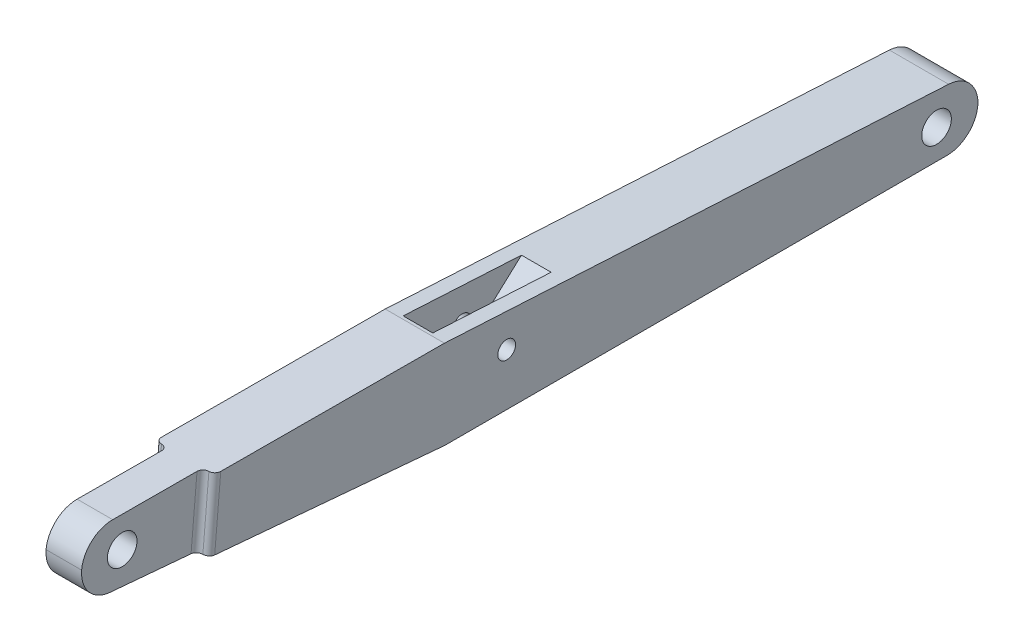
ISO-10303-21;
HEADER;
FILE_DESCRIPTION(('STEP AP214'),'2;1');
FILE_NAME('part.step','',(''),(''),'','','');
FILE_SCHEMA(('AUTOMOTIVE_DESIGN { 1 0 10303 214 1 1 1 1 }'));
ENDSEC;
DATA;
#1=APPLICATION_CONTEXT('core data for automotive mechanical design processes');
#2=APPLICATION_PROTOCOL_DEFINITION('international standard','automotive_design',2000,#1);
#3=PRODUCT_CONTEXT('',#1,'mechanical');
#4=PRODUCT('Part','Part','',(#3));
#5=PRODUCT_RELATED_PRODUCT_CATEGORY('part','',(#4));
#6=PRODUCT_DEFINITION_FORMATION('','',#4);
#7=PRODUCT_DEFINITION_CONTEXT('part definition',#1,'design');
#8=PRODUCT_DEFINITION('design','',#6,#7);
#9=PRODUCT_DEFINITION_SHAPE('','',#8);
#10=(LENGTH_UNIT() NAMED_UNIT(*) SI_UNIT(.MILLI.,.METRE.));
#11=(NAMED_UNIT(*) PLANE_ANGLE_UNIT() SI_UNIT($,.RADIAN.));
#12=(NAMED_UNIT(*) SI_UNIT($,.STERADIAN.) SOLID_ANGLE_UNIT());
#13=UNCERTAINTY_MEASURE_WITH_UNIT(LENGTH_MEASURE(1.E-05),#10,'distance_accuracy_value','');
#14=(GEOMETRIC_REPRESENTATION_CONTEXT(3) GLOBAL_UNCERTAINTY_ASSIGNED_CONTEXT((#13)) GLOBAL_UNIT_ASSIGNED_CONTEXT((#10,
#11,#12)) REPRESENTATION_CONTEXT('',''));
#15=CARTESIAN_POINT('',(0.,0.,0.));
#16=DIRECTION('',(0.,0.,1.));
#17=DIRECTION('',(1.,0.,0.));
#18=AXIS2_PLACEMENT_3D('',#15,#16,#17);
#19=CARTESIAN_POINT('',(-5.00000000000001,10.,-45.));
#20=DIRECTION('',(0.,0.998478855903235,-0.0551359620771031));
#21=DIRECTION('',(0.,0.0551359620771031,0.998478855903235));
#22=AXIS2_PLACEMENT_3D('',#19,#20,#21);
#23=PLANE('',#22);
#24=DIRECTION('',(0.,0.0551359620771031,0.998478855903235));
#25=VECTOR('',#24,1.);
#26=CARTESIAN_POINT('',(4.99999999999999,10.,-45.));
#27=LINE('',#26,#25);
#28=CARTESIAN_POINT('',(4.99999999999999,10.273920608472,-40.0394638009048));
#29=VERTEX_POINT('',#28);
#30=CARTESIAN_POINT('',(5.,14.9738745348943,45.0738532151212));
#31=VERTEX_POINT('',#30);
#32=EDGE_CURVE('E256',#29,#31,#27,.T.);
#33=ORIENTED_EDGE('',*,*,#32,.F.);
#34=DIRECTION('',(-1.,0.,0.));
#35=VECTOR('',#34,1.);
#36=CARTESIAN_POINT('',(-5.00000000000001,10.273920608472,-40.0394638009048));
#37=LINE('',#36,#35);
#38=CARTESIAN_POINT('',(-5.00000000000001,10.273920608472,-40.0394638009048));
#39=VERTEX_POINT('',#38);
#40=EDGE_CURVE('E314',#29,#39,#37,.T.);
#41=ORIENTED_EDGE('',*,*,#40,.T.);
#42=DIRECTION('',(0.,0.0551359620771031,0.998478855903235));
#43=VECTOR('',#42,1.);
#44=CARTESIAN_POINT('',(-5.00000000000001,10.,-45.));
#45=LINE('',#44,#43);
#46=CARTESIAN_POINT('',(-5.,14.9738745348943,45.0738532151212));
#47=VERTEX_POINT('',#46);
#48=EDGE_CURVE('E257',#39,#47,#45,.T.);
#49=ORIENTED_EDGE('',*,*,#48,.T.);
#50=DIRECTION('',(1.,0.,0.));
#51=VECTOR('',#50,1.);
#52=CARTESIAN_POINT('',(-5.,14.9738745348943,45.0738532151212));
#53=LINE('',#52,#51);
#54=EDGE_CURVE('E263',#47,#31,#53,.T.);
#55=ORIENTED_EDGE('',*,*,#54,.T.);
#56=EDGE_LOOP('',(#33,#41,#49,#55));
#57=FACE_BOUND('',#56,.T.);
#58=DIRECTION('',(1.,0.,0.));
#59=VECTOR('',#58,1.);
#60=CARTESIAN_POINT('',(-2.5,14.9442362529549,44.5371218926417));
#61=LINE('',#60,#59);
#62=CARTESIAN_POINT('',(-2.5,14.9442362529549,44.5371218926417));
#63=VERTEX_POINT('',#62);
#64=CARTESIAN_POINT('',(2.5,14.9442362529549,44.5371218926417));
#65=VERTEX_POINT('',#64);
#66=EDGE_CURVE('E236',#63,#65,#61,.T.);
#67=ORIENTED_EDGE('',*,*,#66,.F.);
#68=DIRECTION('',(0.,0.0551359620771032,0.998478855903235));
#69=VECTOR('',#68,1.);
#70=CARTESIAN_POINT('',(-2.5,12.4469444118825,-0.68731976747625));
#71=LINE('',#70,#69);
#72=CARTESIAN_POINT('',(-2.5,13.8412876164544,24.5633905709148));
#73=VERTEX_POINT('',#72);
#74=EDGE_CURVE('E212',#73,#63,#71,.T.);
#75=ORIENTED_EDGE('',*,*,#74,.F.);
#76=DIRECTION('',(1.,0.,0.));
#77=VECTOR('',#76,1.);
#78=CARTESIAN_POINT('',(-2.5,13.8412876164544,24.5633905709148));
#79=LINE('',#78,#77);
#80=CARTESIAN_POINT('',(2.5,13.8412876164544,24.5633905709148));
#81=VERTEX_POINT('',#80);
#82=EDGE_CURVE('E239',#73,#81,#79,.T.);
#83=ORIENTED_EDGE('',*,*,#82,.T.);
#84=DIRECTION('',(0.,0.0551359620771032,0.998478855903235));
#85=VECTOR('',#84,1.);
#86=CARTESIAN_POINT('',(2.5,12.4469444118825,-0.68731976747625));
#87=LINE('',#86,#85);
#88=EDGE_CURVE('E217',#81,#65,#87,.T.);
#89=ORIENTED_EDGE('',*,*,#88,.T.);
#90=EDGE_LOOP('',(#67,#75,#83,#89));
#91=FACE_BOUND('',#90,.T.);
#92=ADVANCED_FACE('F60',(#57,#91),#23,.T.);
#93=CARTESIAN_POINT('',(4.99999999999999,10.,-45.));
#94=DIRECTION('',(-1.,0.,0.));
#95=DIRECTION('',(0.,0.,1.));
#96=AXIS2_PLACEMENT_3D('',#93,#94,#95);
#97=PLANE('',#96);
#98=CARTESIAN_POINT('',(4.99999999999999,5.,-38.));
#99=DIRECTION('',(1.,0.,0.));
#100=DIRECTION('',(0.,0.,-1.));
#101=AXIS2_PLACEMENT_3D('',#98,#99,#100);
#102=CIRCLE('',#101,2.5);
#103=CARTESIAN_POINT('',(4.99999999999999,5.,-40.5));
#104=VERTEX_POINT('',#103);
#105=EDGE_CURVE('E341',#104,#104,#102,.T.);
#106=ORIENTED_EDGE('',*,*,#105,.F.);
#107=EDGE_LOOP('',(#106));
#108=FACE_BOUND('',#107,.T.);
#109=CARTESIAN_POINT('',(5.,8.7714878497158,34.5633905709148));
#110=DIRECTION('',(1.,0.,0.));
#111=DIRECTION('',(0.,0.,-1.));
#112=AXIS2_PLACEMENT_3D('',#109,#110,#111);
#113=CIRCLE('',#112,1.5);
#114=CARTESIAN_POINT('',(5.,8.7714878497158,33.0633905709148));
#115=VERTEX_POINT('',#114);
#116=EDGE_CURVE('E220',#115,#115,#113,.T.);
#117=ORIENTED_EDGE('',*,*,#116,.F.);
#118=EDGE_LOOP('',(#117));
#119=FACE_BOUND('',#118,.T.);
#120=DIRECTION('',(0.,-0.0036958916716528,-0.999993170169052));
#121=VECTOR('',#120,1.);
#122=CARTESIAN_POINT('',(5.00000000000001,15.1912915457768,103.900124458028));
#123=LINE('',#122,#121);
#124=CARTESIAN_POINT('',(5.00000000000001,15.1134060010895,82.8267219718306));
#125=VERTEX_POINT('',#124);
#126=EDGE_CURVE('E261',#125,#31,#123,.T.);
#127=ORIENTED_EDGE('',*,*,#126,.F.);
#128=DIRECTION('',(0.,0.996194698091746,-0.0871557427476552));
#129=VECTOR('',#128,1.);
#130=CARTESIAN_POINT('',(5.00000000000001,21.1372807272312,82.2997012227929));
#131=LINE('',#130,#129);
#132=CARTESIAN_POINT('',(5.,3.39907396715855,83.8515932255781));
#133=VERTEX_POINT('',#132);
#134=EDGE_CURVE('E84',#125,#133,#131,.F.);
#135=ORIENTED_EDGE('',*,*,#134,.T.);
#136=DIRECTION('',(0.,0.087155742747655,0.996194698091746));
#137=VECTOR('',#136,1.);
#138=CARTESIAN_POINT('',(5.,0.,45.));
#139=LINE('',#138,#137);
#140=CARTESIAN_POINT('',(5.,0.,45.));
#141=VERTEX_POINT('',#140);
#142=EDGE_CURVE('E271',#141,#133,#139,.T.);
#143=ORIENTED_EDGE('',*,*,#142,.F.);
#144=DIRECTION('',(0.,0.,-1.));
#145=VECTOR('',#144,1.);
#146=CARTESIAN_POINT('',(4.99999999999999,0.,-45.));
#147=LINE('',#146,#145);
#148=CARTESIAN_POINT('',(4.99999999999999,0.,-39.75));
#149=VERTEX_POINT('',#148);
#150=EDGE_CURVE('E273',#141,#149,#147,.T.);
#151=ORIENTED_EDGE('',*,*,#150,.T.);
#152=CARTESIAN_POINT('',(4.99999999999999,5.25,-39.75));
#153=DIRECTION('',(-1.,0.,0.));
#154=DIRECTION('',(0.,0.,1.));
#155=AXIS2_PLACEMENT_3D('',#152,#153,#154);
#156=CIRCLE('',#155,5.25);
#157=CARTESIAN_POINT('',(4.99999999999999,5.14095330748999,-44.9988673843842));
#158=VERTEX_POINT('',#157);
#159=EDGE_CURVE('E312',#149,#158,#156,.F.);
#160=ORIENTED_EDGE('',*,*,#159,.T.);
#161=CARTESIAN_POINT('',(4.99999999999999,5.03190661497999,-39.75));
#162=DIRECTION('',(-1.,0.,0.));
#163=DIRECTION('',(0.,0.,1.));
#164=AXIS2_PLACEMENT_3D('',#161,#162,#163);
#165=CIRCLE('',#164,5.25);
#166=EDGE_CURVE('E310',#158,#29,#165,.F.);
#167=ORIENTED_EDGE('',*,*,#166,.T.);
#168=ORIENTED_EDGE('',*,*,#32,.T.);
#169=EDGE_LOOP('',(#127,#135,#143,#151,#160,#167,#168));
#170=FACE_BOUND('',#169,.T.);
#171=ADVANCED_FACE('F359',(#108,#119,#170),#97,.F.);
#172=CARTESIAN_POINT('',(-5.00000000000001,10.,-45.));
#173=DIRECTION('',(1.,0.,0.));
#174=DIRECTION('',(0.,0.,-1.));
#175=AXIS2_PLACEMENT_3D('',#172,#173,#174);
#176=PLANE('',#175);
#177=CARTESIAN_POINT('',(-5.00000000000003,5.,-38.));
#178=DIRECTION('',(1.,0.,0.));
#179=DIRECTION('',(0.,0.,-1.));
#180=AXIS2_PLACEMENT_3D('',#177,#178,#179);
#181=CIRCLE('',#180,2.5);
#182=CARTESIAN_POINT('',(-5.00000000000003,5.,-40.5));
#183=VERTEX_POINT('',#182);
#184=EDGE_CURVE('E319',#183,#183,#181,.T.);
#185=ORIENTED_EDGE('',*,*,#184,.T.);
#186=EDGE_LOOP('',(#185));
#187=FACE_BOUND('',#186,.T.);
#188=CARTESIAN_POINT('',(-5.00000000000002,8.7714878497158,34.5633905709148));
#189=DIRECTION('',(1.,0.,0.));
#190=DIRECTION('',(0.,0.,-1.));
#191=AXIS2_PLACEMENT_3D('',#188,#189,#190);
#192=CIRCLE('',#191,1.5);
#193=CARTESIAN_POINT('',(-5.00000000000002,8.7714878497158,33.0633905709148));
#194=VERTEX_POINT('',#193);
#195=EDGE_CURVE('E229',#194,#194,#192,.T.);
#196=ORIENTED_EDGE('',*,*,#195,.T.);
#197=EDGE_LOOP('',(#196));
#198=FACE_BOUND('',#197,.T.);
#199=DIRECTION('',(0.,-0.087155742747655,-0.996194698091746));
#200=VECTOR('',#199,1.);
#201=CARTESIAN_POINT('',(-5.,0.,45.));
#202=LINE('',#201,#200);
#203=CARTESIAN_POINT('',(-5.,3.39907396715855,83.8515932255781));
#204=VERTEX_POINT('',#203);
#205=CARTESIAN_POINT('',(-5.,0.,45.));
#206=VERTEX_POINT('',#205);
#207=EDGE_CURVE('E269',#204,#206,#202,.T.);
#208=ORIENTED_EDGE('',*,*,#207,.F.);
#209=DIRECTION('',(0.,0.996194698091746,-0.0871557427476552));
#210=VECTOR('',#209,1.);
#211=CARTESIAN_POINT('',(-4.99999999999999,21.1372807272312,82.2997012227929));
#212=LINE('',#211,#210);
#213=CARTESIAN_POINT('',(-4.99999999999999,15.1134060010895,82.8267219718306));
#214=VERTEX_POINT('',#213);
#215=EDGE_CURVE('E322',#204,#214,#212,.T.);
#216=ORIENTED_EDGE('',*,*,#215,.T.);
#217=DIRECTION('',(0.,-0.0036958916716528,-0.999993170169052));
#218=VECTOR('',#217,1.);
#219=CARTESIAN_POINT('',(-4.99999999999999,15.1912915457768,103.900124458028));
#220=LINE('',#219,#218);
#221=EDGE_CURVE('E260',#214,#47,#220,.T.);
#222=ORIENTED_EDGE('',*,*,#221,.T.);
#223=ORIENTED_EDGE('',*,*,#48,.F.);
#224=CARTESIAN_POINT('',(-5.00000000000001,5.03190661497999,-39.75));
#225=DIRECTION('',(1.,0.,0.));
#226=DIRECTION('',(0.,0.,-1.));
#227=AXIS2_PLACEMENT_3D('',#224,#225,#226);
#228=CIRCLE('',#227,5.25);
#229=CARTESIAN_POINT('',(-5.00000000000001,5.14095330748999,-44.9988673843842));
#230=VERTEX_POINT('',#229);
#231=EDGE_CURVE('E299',#39,#230,#228,.F.);
#232=ORIENTED_EDGE('',*,*,#231,.T.);
#233=CARTESIAN_POINT('',(-5.00000000000001,5.25,-39.75));
#234=DIRECTION('',(1.,0.,0.));
#235=DIRECTION('',(0.,0.,-1.));
#236=AXIS2_PLACEMENT_3D('',#233,#234,#235);
#237=CIRCLE('',#236,5.25);
#238=CARTESIAN_POINT('',(-5.00000000000001,0.,-39.75));
#239=VERTEX_POINT('',#238);
#240=EDGE_CURVE('E305',#230,#239,#237,.F.);
#241=ORIENTED_EDGE('',*,*,#240,.T.);
#242=DIRECTION('',(0.,0.,1.));
#243=VECTOR('',#242,1.);
#244=CARTESIAN_POINT('',(-5.00000000000001,0.,-45.));
#245=LINE('',#244,#243);
#246=EDGE_CURVE('E276',#239,#206,#245,.T.);
#247=ORIENTED_EDGE('',*,*,#246,.T.);
#248=EDGE_LOOP('',(#208,#216,#222,#223,#232,#241,#247));
#249=FACE_BOUND('',#248,.T.);
#250=ADVANCED_FACE('F411',(#187,#198,#249),#176,.F.);
#251=CARTESIAN_POINT('',(0.,0.,0.));
#252=DIRECTION('',(0.,1.,0.));
#253=DIRECTION('',(0.,0.,1.));
#254=AXIS2_PLACEMENT_3D('',#251,#252,#253);
#255=PLANE('',#254);
#256=ORIENTED_EDGE('',*,*,#246,.F.);
#257=DIRECTION('',(-1.,0.,0.));
#258=VECTOR('',#257,1.);
#259=CARTESIAN_POINT('',(0.,0.,-39.75));
#260=LINE('',#259,#258);
#261=EDGE_CURVE('E307',#239,#149,#260,.F.);
#262=ORIENTED_EDGE('',*,*,#261,.T.);
#263=ORIENTED_EDGE('',*,*,#150,.F.);
#264=DIRECTION('',(1.,0.,0.));
#265=VECTOR('',#264,1.);
#266=CARTESIAN_POINT('',(-5.,0.,45.));
#267=LINE('',#266,#265);
#268=EDGE_CURVE('E279',#206,#141,#267,.T.);
#269=ORIENTED_EDGE('',*,*,#268,.F.);
#270=EDGE_LOOP('',(#256,#262,#263,#269));
#271=FACE_BOUND('',#270,.T.);
#272=ADVANCED_FACE('F418',(#271),#255,.F.);
#273=CARTESIAN_POINT('',(0.,-3.90708399750579,0.341825557225294));
#274=DIRECTION('',(0.,0.996194698091746,-0.087155742747655));
#275=DIRECTION('',(0.,0.087155742747655,0.996194698091746));
#276=AXIS2_PLACEMENT_3D('',#273,#274,#275);
#277=PLANE('',#276);
#278=DIRECTION('',(0.,-0.0871557427476549,-0.996194698091746));
#279=VECTOR('',#278,1.);
#280=CARTESIAN_POINT('',(-2.99999999999999,5.2293445648593,104.771681885505));
#281=LINE('',#280,#279);
#282=CARTESIAN_POINT('',(-2.99999999999999,4.77177691543412,99.5416597205231));
#283=VERTEX_POINT('',#282);
#284=CARTESIAN_POINT('',(-2.99999999999999,3.57338545265386,85.8439826217616));
#285=VERTEX_POINT('',#284);
#286=EDGE_CURVE('E253',#283,#285,#281,.T.);
#287=ORIENTED_EDGE('',*,*,#286,.T.);
#288=CARTESIAN_POINT('',(-3.99999999999999,3.57338545265386,85.8439826217616));
#289=DIRECTION('',(0.,0.996194698091746,-0.087155742747655));
#290=DIRECTION('',(0.,0.087155742747655,0.996194698091746));
#291=AXIS2_PLACEMENT_3D('',#288,#289,#290);
#292=CIRCLE('',#291,1.);
#293=CARTESIAN_POINT('',(-3.99999999999999,3.48622970990621,84.8477879236698));
#294=VERTEX_POINT('',#293);
#295=EDGE_CURVE('E337',#285,#294,#292,.T.);
#296=ORIENTED_EDGE('',*,*,#295,.T.);
#297=CARTESIAN_POINT('',(-3.99999999999999,3.39907396715855,83.8515932255781));
#298=DIRECTION('',(0.,0.996194698091746,-0.087155742747655));
#299=DIRECTION('',(0.,0.087155742747655,0.996194698091746));
#300=AXIS2_PLACEMENT_3D('',#297,#298,#299);
#301=CIRCLE('',#300,1.);
#302=EDGE_CURVE('E329',#294,#204,#301,.F.);
#303=ORIENTED_EDGE('',*,*,#302,.T.);
#304=ORIENTED_EDGE('',*,*,#207,.T.);
#305=ORIENTED_EDGE('',*,*,#268,.T.);
#306=ORIENTED_EDGE('',*,*,#142,.T.);
#307=CARTESIAN_POINT('',(4.00000000000001,3.39907396715855,83.8515932255781));
#308=DIRECTION('',(0.,0.996194698091746,-0.087155742747655));
#309=DIRECTION('',(0.,0.087155742747655,0.996194698091746));
#310=AXIS2_PLACEMENT_3D('',#307,#308,#309);
#311=CIRCLE('',#310,1.);
#312=CARTESIAN_POINT('',(4.00000000000001,3.48622970990621,84.8477879236698));
#313=VERTEX_POINT('',#312);
#314=EDGE_CURVE('E76',#133,#313,#311,.F.);
#315=ORIENTED_EDGE('',*,*,#314,.T.);
#316=CARTESIAN_POINT('',(4.00000000000001,3.57338545265385,85.8439826217616));
#317=DIRECTION('',(0.,0.996194698091746,-0.087155742747655));
#318=DIRECTION('',(0.,0.087155742747655,0.996194698091746));
#319=AXIS2_PLACEMENT_3D('',#316,#317,#318);
#320=CIRCLE('',#319,1.);
#321=CARTESIAN_POINT('',(3.00000000000001,3.57338545265386,85.8439826217616));
#322=VERTEX_POINT('',#321);
#323=EDGE_CURVE('E12',#313,#322,#320,.T.);
#324=ORIENTED_EDGE('',*,*,#323,.T.);
#325=DIRECTION('',(0.,-0.0871557427476549,-0.996194698091746));
#326=VECTOR('',#325,1.);
#327=CARTESIAN_POINT('',(3.00000000000001,5.2293445648593,104.771681885505));
#328=LINE('',#327,#326);
#329=CARTESIAN_POINT('',(3.00000000000001,4.77177691543412,99.5416597205231));
#330=VERTEX_POINT('',#329);
#331=EDGE_CURVE('E248',#330,#322,#328,.T.);
#332=ORIENTED_EDGE('',*,*,#331,.F.);
#333=DIRECTION('',(-1.,0.,0.));
#334=VECTOR('',#333,1.);
#335=CARTESIAN_POINT('',(-2.99999999999999,4.77177691543411,99.5416597205231));
#336=LINE('',#335,#334);
#337=EDGE_CURVE('E282',#330,#283,#336,.T.);
#338=ORIENTED_EDGE('',*,*,#337,.T.);
#339=EDGE_LOOP('',(#287,#296,#303,#304,#305,#306,#315,#324,#332,#338));
#340=FACE_BOUND('',#339,.T.);
#341=ADVANCED_FACE('F389',(#340),#277,.F.);
#342=CARTESIAN_POINT('',(-4.99999999999999,15.1912915457768,103.900124458028));
#343=DIRECTION('',(0.,-0.999993170169053,0.0036958916716528));
#344=DIRECTION('',(0.,-0.0036958916716528,-0.999993170169053));
#345=AXIS2_PLACEMENT_3D('',#342,#343,#344);
#346=PLANE('',#345);
#347=ORIENTED_EDGE('',*,*,#221,.F.);
#348=CARTESIAN_POINT('',(-3.99999999999999,15.1134060010895,82.8267219718306));
#349=DIRECTION('',(0.,-0.999993170169053,0.0036958916716528));
#350=DIRECTION('',(0.,-0.0036958916716528,-0.999993170169053));
#351=AXIS2_PLACEMENT_3D('',#348,#349,#350);
#352=ELLIPSE('',#351,1.00350221023605,1.);
#353=CARTESIAN_POINT('',(-3.99999999999999,15.1171148365508,83.8302173283162));
#354=VERTEX_POINT('',#353);
#355=EDGE_CURVE('E326',#214,#354,#352,.F.);
#356=ORIENTED_EDGE('',*,*,#355,.T.);
#357=CARTESIAN_POINT('',(-3.99999999999999,15.1208236720121,84.8337126848018));
#358=DIRECTION('',(0.,-0.999993170169053,0.0036958916716528));
#359=DIRECTION('',(0.,0.0036958916716528,0.999993170169053));
#360=AXIS2_PLACEMENT_3D('',#357,#358,#359);
#361=ELLIPSE('',#360,1.00350221023605,1.);
#362=CARTESIAN_POINT('',(-2.99999999999999,15.1208236720121,84.8337126848018));
#363=VERTEX_POINT('',#362);
#364=EDGE_CURVE('E335',#354,#363,#361,.T.);
#365=ORIENTED_EDGE('',*,*,#364,.T.);
#366=DIRECTION('',(0.,0.00369589167165288,0.999993170169052));
#367=VECTOR('',#366,1.);
#368=CARTESIAN_POINT('',(-2.99999999999999,15.1171148365508,83.8302173283162));
#369=LINE('',#368,#367);
#370=CARTESIAN_POINT('',(-2.99999999999999,15.1734455008498,99.0715405527333));
#371=VERTEX_POINT('',#370);
#372=EDGE_CURVE('E251',#363,#371,#369,.T.);
#373=ORIENTED_EDGE('',*,*,#372,.T.);
#374=DIRECTION('',(-1.,0.,0.));
#375=VECTOR('',#374,1.);
#376=CARTESIAN_POINT('',(3.00000000000001,15.1734455008498,99.0715405527333));
#377=LINE('',#376,#375);
#378=CARTESIAN_POINT('',(3.00000000000001,15.1734455008498,99.0715405527333));
#379=VERTEX_POINT('',#378);
#380=EDGE_CURVE('E296',#371,#379,#377,.F.);
#381=ORIENTED_EDGE('',*,*,#380,.T.);
#382=DIRECTION('',(0.,0.00369589167165288,0.999993170169052));
#383=VECTOR('',#382,1.);
#384=CARTESIAN_POINT('',(3.00000000000001,15.1171148365508,83.8302173283162));
#385=LINE('',#384,#383);
#386=CARTESIAN_POINT('',(3.00000000000001,15.1208236720121,84.8337126848018));
#387=VERTEX_POINT('',#386);
#388=EDGE_CURVE('E246',#387,#379,#385,.T.);
#389=ORIENTED_EDGE('',*,*,#388,.F.);
#390=CARTESIAN_POINT('',(4.00000000000001,15.1208236720121,84.8337126848018));
#391=DIRECTION('',(0.,-0.999993170169053,0.0036958916716528));
#392=DIRECTION('',(0.,0.0036958916716528,0.999993170169053));
#393=AXIS2_PLACEMENT_3D('',#390,#391,#392);
#394=ELLIPSE('',#393,1.00350221023605,1.);
#395=CARTESIAN_POINT('',(4.00000000000001,15.1171148365508,83.8302173283162));
#396=VERTEX_POINT('',#395);
#397=EDGE_CURVE('E69',#387,#396,#394,.T.);
#398=ORIENTED_EDGE('',*,*,#397,.T.);
#399=CARTESIAN_POINT('',(4.00000000000001,15.1134060010895,82.8267219718306));
#400=DIRECTION('',(0.,-0.999993170169053,0.0036958916716528));
#401=DIRECTION('',(0.,-0.0036958916716528,-0.999993170169053));
#402=AXIS2_PLACEMENT_3D('',#399,#400,#401);
#403=ELLIPSE('',#402,1.00350221023605,1.);
#404=EDGE_CURVE('E324',#396,#125,#403,.F.);
#405=ORIENTED_EDGE('',*,*,#404,.T.);
#406=ORIENTED_EDGE('',*,*,#126,.T.);
#407=ORIENTED_EDGE('',*,*,#54,.F.);
#408=EDGE_LOOP('',(#347,#356,#365,#373,#381,#389,#398,#405,#406,#407));
#409=FACE_BOUND('',#408,.T.);
#410=ADVANCED_FACE('F356',(#409),#346,.F.);
#411=CARTESIAN_POINT('',(-3.,0.,0.));
#412=DIRECTION('',(1.,0.,0.));
#413=DIRECTION('',(0.,0.,-1.));
#414=AXIS2_PLACEMENT_3D('',#411,#412,#413);
#415=PLANE('',#414);
#416=CARTESIAN_POINT('',(-2.99999999999999,10.,97.4675227188797));
#417=DIRECTION('',(1.,0.,0.));
#418=DIRECTION('',(0.,0.,-1.));
#419=AXIS2_PLACEMENT_3D('',#416,#417,#418);
#420=CIRCLE('',#419,2.5);
#421=CARTESIAN_POINT('',(-2.99999999999999,10.,94.9675227188797));
#422=VERTEX_POINT('',#421);
#423=EDGE_CURVE('E243',#422,#422,#420,.T.);
#424=ORIENTED_EDGE('',*,*,#423,.T.);
#425=EDGE_LOOP('',(#424));
#426=FACE_BOUND('',#425,.T.);
#427=ORIENTED_EDGE('',*,*,#372,.F.);
#428=DIRECTION('',(0.,0.996194698091746,-0.0871557427476552));
#429=VECTOR('',#428,1.);
#430=CARTESIAN_POINT('',(-2.99999999999999,3.57338545265386,85.8439826217616));
#431=LINE('',#430,#429);
#432=EDGE_CURVE('E316',#363,#285,#431,.F.);
#433=ORIENTED_EDGE('',*,*,#432,.T.);
#434=ORIENTED_EDGE('',*,*,#286,.F.);
#435=CARTESIAN_POINT('',(-2.99999999999999,10.0017990804158,99.0840920710979));
#436=DIRECTION('',(1.,0.,0.));
#437=DIRECTION('',(0.,0.,-1.));
#438=AXIS2_PLACEMENT_3D('',#435,#436,#437);
#439=CIRCLE('',#438,5.25);
#440=CARTESIAN_POINT('',(-2.99999999999999,10.4201950425647,104.317393592973));
#441=VERTEX_POINT('',#440);
#442=EDGE_CURVE('E290',#283,#441,#439,.F.);
#443=ORIENTED_EDGE('',*,*,#442,.T.);
#444=CARTESIAN_POINT('',(-2.99999999999999,9.92348135746231,99.0909439840095));
#445=DIRECTION('',(1.,0.,0.));
#446=DIRECTION('',(0.,0.,-1.));
#447=AXIS2_PLACEMENT_3D('',#444,#445,#446);
#448=CIRCLE('',#447,5.25);
#449=EDGE_CURVE('E287',#441,#371,#448,.F.);
#450=ORIENTED_EDGE('',*,*,#449,.T.);
#451=EDGE_LOOP('',(#427,#433,#434,#443,#450));
#452=FACE_BOUND('',#451,.T.);
#453=ADVANCED_FACE('F376',(#426,#452),#415,.F.);
#454=CARTESIAN_POINT('',(3.,0.,0.));
#455=DIRECTION('',(-1.,0.,0.));
#456=DIRECTION('',(0.,0.,1.));
#457=AXIS2_PLACEMENT_3D('',#454,#455,#456);
#458=PLANE('',#457);
#459=CARTESIAN_POINT('',(3.00000000000001,10.,97.4675227188797));
#460=DIRECTION('',(-1.,0.,0.));
#461=DIRECTION('',(0.,0.,1.));
#462=AXIS2_PLACEMENT_3D('',#459,#460,#461);
#463=CIRCLE('',#462,2.5);
#464=CARTESIAN_POINT('',(3.00000000000001,10.,99.9675227188797));
#465=VERTEX_POINT('',#464);
#466=EDGE_CURVE('E238',#465,#465,#463,.T.);
#467=ORIENTED_EDGE('',*,*,#466,.T.);
#468=EDGE_LOOP('',(#467));
#469=FACE_BOUND('',#468,.T.);
#470=ORIENTED_EDGE('',*,*,#331,.T.);
#471=DIRECTION('',(0.,0.996194698091746,-0.0871557427476552));
#472=VECTOR('',#471,1.);
#473=CARTESIAN_POINT('',(3.00000000000001,15.2042705792985,84.8264120264079));
#474=LINE('',#473,#472);
#475=EDGE_CURVE('E331',#322,#387,#474,.T.);
#476=ORIENTED_EDGE('',*,*,#475,.T.);
#477=ORIENTED_EDGE('',*,*,#388,.T.);
#478=CARTESIAN_POINT('',(3.00000000000001,9.92348135746231,99.0909439840095));
#479=DIRECTION('',(-1.,0.,0.));
#480=DIRECTION('',(0.,0.,1.));
#481=AXIS2_PLACEMENT_3D('',#478,#479,#480);
#482=CIRCLE('',#481,5.25);
#483=CARTESIAN_POINT('',(3.00000000000001,10.4201950425647,104.317393592973));
#484=VERTEX_POINT('',#483);
#485=EDGE_CURVE('E292',#379,#484,#482,.F.);
#486=ORIENTED_EDGE('',*,*,#485,.T.);
#487=CARTESIAN_POINT('',(3.00000000000001,10.0017990804158,99.0840920710979));
#488=DIRECTION('',(-1.,0.,0.));
#489=DIRECTION('',(0.,0.,1.));
#490=AXIS2_PLACEMENT_3D('',#487,#488,#489);
#491=CIRCLE('',#490,5.25);
#492=EDGE_CURVE('E294',#484,#330,#491,.F.);
#493=ORIENTED_EDGE('',*,*,#492,.T.);
#494=EDGE_LOOP('',(#470,#476,#477,#486,#493));
#495=FACE_BOUND('',#494,.T.);
#496=ADVANCED_FACE('F385',(#469,#495),#458,.F.);
#497=CARTESIAN_POINT('',(-4.99999999999999,10.,97.4675227188797));
#498=DIRECTION('',(1.,0.,0.));
#499=DIRECTION('',(0.,0.,-1.));
#500=AXIS2_PLACEMENT_3D('',#497,#498,#499);
#501=CYLINDRICAL_SURFACE('',#500,2.5);
#502=ORIENTED_EDGE('',*,*,#466,.F.);
#503=EDGE_LOOP('',(#502));
#504=FACE_BOUND('',#503,.T.);
#505=ORIENTED_EDGE('',*,*,#423,.F.);
#506=EDGE_LOOP('',(#505));
#507=FACE_BOUND('',#506,.T.);
#508=ADVANCED_FACE('F474',(#504,#507),#501,.F.);
#509=CARTESIAN_POINT('',(-2.5,-15.1728469112391,16.0294172264955));
#510=DIRECTION('',(0.,-0.687436170415835,0.726244801429938));
#511=DIRECTION('',(0.,-0.726244801429938,-0.687436170415835));
#512=AXIS2_PLACEMENT_3D('',#509,#510,#511);
#513=PLANE('',#512);
#514=DIRECTION('',(0.,-0.726244801429938,-0.687436170415835));
#515=VECTOR('',#514,1.);
#516=CARTESIAN_POINT('',(2.5,-15.1728469112391,16.0294172264955));
#517=LINE('',#516,#515);
#518=CARTESIAN_POINT('',(2.5,6.7091793384683,36.7421249752046));
#519=VERTEX_POINT('',#518);
#520=EDGE_CURVE('E194',#65,#519,#517,.T.);
#521=ORIENTED_EDGE('',*,*,#520,.T.);
#522=DIRECTION('',(1.,0.,0.));
#523=VECTOR('',#522,1.);
#524=CARTESIAN_POINT('',(-2.5,6.7091793384683,36.7421249752046));
#525=LINE('',#524,#523);
#526=CARTESIAN_POINT('',(-2.5,6.7091793384683,36.7421249752046));
#527=VERTEX_POINT('',#526);
#528=EDGE_CURVE('E187',#527,#519,#525,.T.);
#529=ORIENTED_EDGE('',*,*,#528,.F.);
#530=DIRECTION('',(0.,-0.726244801429938,-0.687436170415835));
#531=VECTOR('',#530,1.);
#532=CARTESIAN_POINT('',(-2.5,-15.1728469112391,16.0294172264955));
#533=LINE('',#532,#531);
#534=EDGE_CURVE('E192',#63,#527,#533,.T.);
#535=ORIENTED_EDGE('',*,*,#534,.F.);
#536=ORIENTED_EDGE('',*,*,#66,.T.);
#537=EDGE_LOOP('',(#521,#529,#535,#536));
#538=FACE_BOUND('',#537,.T.);
#539=ADVANCED_FACE('F189',(#538),#513,.F.);
#540=CARTESIAN_POINT('',(-2.5,19.7781756652407,18.0626315721729));
#541=DIRECTION('',(0.,0.738405601636361,0.674356854693451));
#542=DIRECTION('',(0.,-0.674356854693451,0.738405601636361));
#543=AXIS2_PLACEMENT_3D('',#540,#541,#542);
#544=PLANE('',#543);
#545=DIRECTION('',(0.,-0.674356854693451,0.738405601636361));
#546=VECTOR('',#545,1.);
#547=CARTESIAN_POINT('',(2.5,19.7781756652407,18.0626315721729));
#548=LINE('',#547,#546);
#549=CARTESIAN_POINT('',(2.5,6.55627104480672,32.5403200068345));
#550=VERTEX_POINT('',#549);
#551=EDGE_CURVE('E231',#81,#550,#548,.T.);
#552=ORIENTED_EDGE('',*,*,#551,.F.);
#553=ORIENTED_EDGE('',*,*,#82,.F.);
#554=DIRECTION('',(0.,-0.674356854693451,0.738405601636361));
#555=VECTOR('',#554,1.);
#556=CARTESIAN_POINT('',(-2.5,19.7781756652407,18.0626315721729));
#557=LINE('',#556,#555);
#558=CARTESIAN_POINT('',(-2.5,6.55627104480672,32.5403200068345));
#559=VERTEX_POINT('',#558);
#560=EDGE_CURVE('E207',#73,#559,#557,.T.);
#561=ORIENTED_EDGE('',*,*,#560,.T.);
#562=DIRECTION('',(1.,0.,0.));
#563=VECTOR('',#562,1.);
#564=CARTESIAN_POINT('',(-2.5,6.55627104480672,32.5403200068345));
#565=LINE('',#564,#563);
#566=EDGE_CURVE('E198',#559,#550,#565,.T.);
#567=ORIENTED_EDGE('',*,*,#566,.T.);
#568=EDGE_LOOP('',(#552,#553,#561,#567));
#569=FACE_BOUND('',#568,.T.);
#570=ADVANCED_FACE('F580',(#569),#544,.T.);
#571=CARTESIAN_POINT('',(-2.5,8.7714878497158,34.5633905709148));
#572=DIRECTION('',(1.,0.,0.));
#573=DIRECTION('',(0.,0.,-1.));
#574=AXIS2_PLACEMENT_3D('',#571,#572,#573);
#575=CYLINDRICAL_SURFACE('',#574,2.99999999999999);
#576=CARTESIAN_POINT('',(2.5,8.7714878497158,34.5633905709148));
#577=DIRECTION('',(1.,0.,0.));
#578=DIRECTION('',(0.,0.,-1.));
#579=AXIS2_PLACEMENT_3D('',#576,#577,#578);
#580=CIRCLE('',#579,2.99999999999999);
#581=EDGE_CURVE('E228',#519,#550,#580,.T.);
#582=ORIENTED_EDGE('',*,*,#581,.T.);
#583=ORIENTED_EDGE('',*,*,#566,.F.);
#584=CARTESIAN_POINT('',(-2.5,8.7714878497158,34.5633905709148));
#585=DIRECTION('',(1.,0.,0.));
#586=DIRECTION('',(0.,0.,-1.));
#587=AXIS2_PLACEMENT_3D('',#584,#585,#586);
#588=CIRCLE('',#587,2.99999999999999);
#589=EDGE_CURVE('E203',#527,#559,#588,.T.);
#590=ORIENTED_EDGE('',*,*,#589,.F.);
#591=ORIENTED_EDGE('',*,*,#528,.T.);
#592=EDGE_LOOP('',(#582,#583,#590,#591));
#593=FACE_BOUND('',#592,.T.);
#594=ADVANCED_FACE('F204',(#593),#575,.F.);
#595=CARTESIAN_POINT('',(-2.5,0.,0.));
#596=DIRECTION('',(1.,0.,0.));
#597=DIRECTION('',(0.,0.,-1.));
#598=AXIS2_PLACEMENT_3D('',#595,#596,#597);
#599=PLANE('',#598);
#600=ORIENTED_EDGE('',*,*,#534,.T.);
#601=ORIENTED_EDGE('',*,*,#589,.T.);
#602=ORIENTED_EDGE('',*,*,#560,.F.);
#603=ORIENTED_EDGE('',*,*,#74,.T.);
#604=EDGE_LOOP('',(#600,#601,#602,#603));
#605=FACE_BOUND('',#604,.T.);
#606=CARTESIAN_POINT('',(-2.5,8.7714878497158,34.5633905709148));
#607=DIRECTION('',(1.,0.,0.));
#608=DIRECTION('',(0.,0.,-1.));
#609=AXIS2_PLACEMENT_3D('',#606,#607,#608);
#610=CIRCLE('',#609,1.5);
#611=CARTESIAN_POINT('',(-2.5,8.7714878497158,33.0633905709148));
#612=VERTEX_POINT('',#611);
#613=EDGE_CURVE('E199',#612,#612,#610,.T.);
#614=ORIENTED_EDGE('',*,*,#613,.F.);
#615=EDGE_LOOP('',(#614));
#616=FACE_BOUND('',#615,.T.);
#617=ADVANCED_FACE('F209',(#605,#616),#599,.T.);
#618=CARTESIAN_POINT('',(2.5,0.,0.));
#619=DIRECTION('',(1.,0.,0.));
#620=DIRECTION('',(0.,0.,-1.));
#621=AXIS2_PLACEMENT_3D('',#618,#619,#620);
#622=PLANE('',#621);
#623=CARTESIAN_POINT('',(2.5,8.7714878497158,34.5633905709148));
#624=DIRECTION('',(1.,0.,0.));
#625=DIRECTION('',(0.,0.,-1.));
#626=AXIS2_PLACEMENT_3D('',#623,#624,#625);
#627=CIRCLE('',#626,1.5);
#628=CARTESIAN_POINT('',(2.5,8.7714878497158,33.0633905709148));
#629=VERTEX_POINT('',#628);
#630=EDGE_CURVE('E214',#629,#629,#627,.T.);
#631=ORIENTED_EDGE('',*,*,#630,.T.);
#632=EDGE_LOOP('',(#631));
#633=FACE_BOUND('',#632,.T.);
#634=ORIENTED_EDGE('',*,*,#520,.F.);
#635=ORIENTED_EDGE('',*,*,#88,.F.);
#636=ORIENTED_EDGE('',*,*,#551,.T.);
#637=ORIENTED_EDGE('',*,*,#581,.F.);
#638=EDGE_LOOP('',(#634,#635,#636,#637));
#639=FACE_BOUND('',#638,.T.);
#640=ADVANCED_FACE('F556',(#633,#639),#622,.F.);
#641=CARTESIAN_POINT('',(-5.00000000000002,8.7714878497158,34.5633905709148));
#642=DIRECTION('',(1.,0.,0.));
#643=DIRECTION('',(0.,0.,-1.));
#644=AXIS2_PLACEMENT_3D('',#641,#642,#643);
#645=CYLINDRICAL_SURFACE('',#644,1.5);
#646=ORIENTED_EDGE('',*,*,#116,.T.);
#647=EDGE_LOOP('',(#646));
#648=FACE_BOUND('',#647,.T.);
#649=ORIENTED_EDGE('',*,*,#630,.F.);
#650=EDGE_LOOP('',(#649));
#651=FACE_BOUND('',#650,.T.);
#652=ADVANCED_FACE('F546',(#648,#651),#645,.F.);
#653=ORIENTED_EDGE('',*,*,#613,.T.);
#654=EDGE_LOOP('',(#653));
#655=FACE_BOUND('',#654,.T.);
#656=ORIENTED_EDGE('',*,*,#195,.F.);
#657=EDGE_LOOP('',(#656));
#658=FACE_BOUND('',#657,.T.);
#659=ADVANCED_FACE('F403',(#655,#658),#645,.F.);
#660=CARTESIAN_POINT('',(-5.,9.92348135746231,99.0909439840095));
#661=DIRECTION('',(1.,0.,0.));
#662=DIRECTION('',(0.,1.,0.));
#663=AXIS2_PLACEMENT_3D('',#660,#661,#662);
#664=CYLINDRICAL_SURFACE('',#663,5.25);
#665=DIRECTION('',(1.,0.,0.));
#666=VECTOR('',#665,1.);
#667=CARTESIAN_POINT('',(0.,10.4201950425647,104.317393592973));
#668=LINE('',#667,#666);
#669=EDGE_CURVE('E300',#484,#441,#668,.F.);
#670=ORIENTED_EDGE('',*,*,#669,.F.);
#671=ORIENTED_EDGE('',*,*,#485,.F.);
#672=ORIENTED_EDGE('',*,*,#380,.F.);
#673=ORIENTED_EDGE('',*,*,#449,.F.);
#674=EDGE_LOOP('',(#670,#671,#672,#673));
#675=FACE_BOUND('',#674,.T.);
#676=ADVANCED_FACE('F383',(#675),#664,.T.);
#677=CARTESIAN_POINT('',(0.,10.0017990804158,99.0840920710979));
#678=DIRECTION('',(1.,0.,0.));
#679=DIRECTION('',(0.,0.,-1.));
#680=AXIS2_PLACEMENT_3D('',#677,#678,#679);
#681=CYLINDRICAL_SURFACE('',#680,5.25);
#682=ORIENTED_EDGE('',*,*,#492,.F.);
#683=ORIENTED_EDGE('',*,*,#669,.T.);
#684=ORIENTED_EDGE('',*,*,#442,.F.);
#685=ORIENTED_EDGE('',*,*,#337,.F.);
#686=EDGE_LOOP('',(#682,#683,#684,#685));
#687=FACE_BOUND('',#686,.T.);
#688=ADVANCED_FACE('F391',(#687),#681,.T.);
#689=CARTESIAN_POINT('',(-5.00000000000001,5.03190661497999,-39.75));
#690=DIRECTION('',(1.,0.,0.));
#691=DIRECTION('',(0.,1.,0.));
#692=AXIS2_PLACEMENT_3D('',#689,#690,#691);
#693=CYLINDRICAL_SURFACE('',#692,5.25);
#694=ORIENTED_EDGE('',*,*,#40,.F.);
#695=ORIENTED_EDGE('',*,*,#166,.F.);
#696=DIRECTION('',(1.,0.,0.));
#697=VECTOR('',#696,1.);
#698=CARTESIAN_POINT('',(0.,5.14095330748999,-44.9988673843842));
#699=LINE('',#698,#697);
#700=EDGE_CURVE('E303',#230,#158,#699,.T.);
#701=ORIENTED_EDGE('',*,*,#700,.F.);
#702=ORIENTED_EDGE('',*,*,#231,.F.);
#703=EDGE_LOOP('',(#694,#695,#701,#702));
#704=FACE_BOUND('',#703,.T.);
#705=ADVANCED_FACE('F393',(#704),#693,.T.);
#706=CARTESIAN_POINT('',(-5.00000000000001,5.25,-39.75));
#707=DIRECTION('',(-1.,0.,0.));
#708=DIRECTION('',(0.,0.,1.));
#709=AXIS2_PLACEMENT_3D('',#706,#707,#708);
#710=CYLINDRICAL_SURFACE('',#709,5.25);
#711=ORIENTED_EDGE('',*,*,#159,.F.);
#712=ORIENTED_EDGE('',*,*,#261,.F.);
#713=ORIENTED_EDGE('',*,*,#240,.F.);
#714=ORIENTED_EDGE('',*,*,#700,.T.);
#715=EDGE_LOOP('',(#711,#712,#713,#714));
#716=FACE_BOUND('',#715,.T.);
#717=ADVANCED_FACE('F400',(#716),#710,.T.);
#718=CARTESIAN_POINT('',(-5.00000000000003,5.,-38.));
#719=DIRECTION('',(1.,0.,0.));
#720=DIRECTION('',(0.,0.,-1.));
#721=AXIS2_PLACEMENT_3D('',#718,#719,#720);
#722=CYLINDRICAL_SURFACE('',#721,2.5);
#723=ORIENTED_EDGE('',*,*,#184,.F.);
#724=EDGE_LOOP('',(#723));
#725=FACE_BOUND('',#724,.T.);
#726=ORIENTED_EDGE('',*,*,#105,.T.);
#727=EDGE_LOOP('',(#726));
#728=FACE_BOUND('',#727,.T.);
#729=ADVANCED_FACE('F439',(#725,#728),#722,.F.);
#730=CARTESIAN_POINT('',(-3.99999999999999,21.1372807272312,82.2997012227929));
#731=DIRECTION('',(0.,0.996194698091746,-0.0871557427476552));
#732=DIRECTION('',(0.,0.0871557427476552,0.996194698091746));
#733=AXIS2_PLACEMENT_3D('',#730,#731,#732);
#734=CYLINDRICAL_SURFACE('',#733,1.);
#735=ORIENTED_EDGE('',*,*,#215,.F.);
#736=ORIENTED_EDGE('',*,*,#302,.F.);
#737=DIRECTION('',(0.,0.996194698091746,-0.0871557427476552));
#738=VECTOR('',#737,1.);
#739=CARTESIAN_POINT('',(-3.99999999999999,3.48622970990621,84.8477879236698));
#740=LINE('',#739,#738);
#741=EDGE_CURVE('E339',#354,#294,#740,.F.);
#742=ORIENTED_EDGE('',*,*,#741,.F.);
#743=ORIENTED_EDGE('',*,*,#355,.F.);
#744=EDGE_LOOP('',(#735,#736,#742,#743));
#745=FACE_BOUND('',#744,.T.);
#746=ADVANCED_FACE('F370',(#745),#734,.T.);
#747=CARTESIAN_POINT('',(-3.99999999999999,3.57338545265386,85.8439826217616));
#748=DIRECTION('',(0.,-0.996194698091746,0.0871557427476552));
#749=DIRECTION('',(0.,-0.0871557427476552,-0.996194698091746));
#750=AXIS2_PLACEMENT_3D('',#747,#748,#749);
#751=CYLINDRICAL_SURFACE('',#750,1.);
#752=ORIENTED_EDGE('',*,*,#295,.F.);
#753=ORIENTED_EDGE('',*,*,#432,.F.);
#754=ORIENTED_EDGE('',*,*,#364,.F.);
#755=ORIENTED_EDGE('',*,*,#741,.T.);
#756=EDGE_LOOP('',(#752,#753,#754,#755));
#757=FACE_BOUND('',#756,.T.);
#758=ADVANCED_FACE('F373',(#757),#751,.F.);
#759=CARTESIAN_POINT('',(4.00000000000001,3.39907396715855,83.8515932255781));
#760=DIRECTION('',(0.,0.996194698091746,-0.0871557427476552));
#761=DIRECTION('',(0.,0.0871557427476552,0.996194698091746));
#762=AXIS2_PLACEMENT_3D('',#759,#760,#761);
#763=CYLINDRICAL_SURFACE('',#762,1.);
#764=DIRECTION('',(0.,0.996194698091746,-0.0871557427476552));
#765=VECTOR('',#764,1.);
#766=CARTESIAN_POINT('',(4.00000000000001,3.48622970990621,84.8477879236698));
#767=LINE('',#766,#765);
#768=EDGE_CURVE('E64',#313,#396,#767,.T.);
#769=ORIENTED_EDGE('',*,*,#768,.F.);
#770=ORIENTED_EDGE('',*,*,#314,.F.);
#771=ORIENTED_EDGE('',*,*,#134,.F.);
#772=ORIENTED_EDGE('',*,*,#404,.F.);
#773=EDGE_LOOP('',(#769,#770,#771,#772));
#774=FACE_BOUND('',#773,.T.);
#775=ADVANCED_FACE('F62',(#774),#763,.T.);
#776=CARTESIAN_POINT('',(4.00000000000001,7.48046945015966,85.5021570645363));
#777=DIRECTION('',(0.,-0.996194698091746,0.0871557427476552));
#778=DIRECTION('',(0.,-0.0871557427476552,-0.996194698091746));
#779=AXIS2_PLACEMENT_3D('',#776,#777,#778);
#780=CYLINDRICAL_SURFACE('',#779,1.);
#781=ORIENTED_EDGE('',*,*,#323,.F.);
#782=ORIENTED_EDGE('',*,*,#768,.T.);
#783=ORIENTED_EDGE('',*,*,#397,.F.);
#784=ORIENTED_EDGE('',*,*,#475,.F.);
#785=EDGE_LOOP('',(#781,#782,#783,#784));
#786=FACE_BOUND('',#785,.T.);
#787=ADVANCED_FACE('F350',(#786),#780,.F.);
#788=CLOSED_SHELL('',(#92,#171,#250,#272,#341,#410,#453,#496,#508,#539,#570,#594,#617,#640,#652,
#659,#676,#688,#705,#717,#729,#746,#758,#775,#787));
#789=MANIFOLD_SOLID_BREP('B2',#788);
#790=ADVANCED_BREP_SHAPE_REPRESENTATION('',(#18,#789),#14);
#791=SHAPE_DEFINITION_REPRESENTATION(#9,#790);
ENDSEC;
END-ISO-10303-21;
